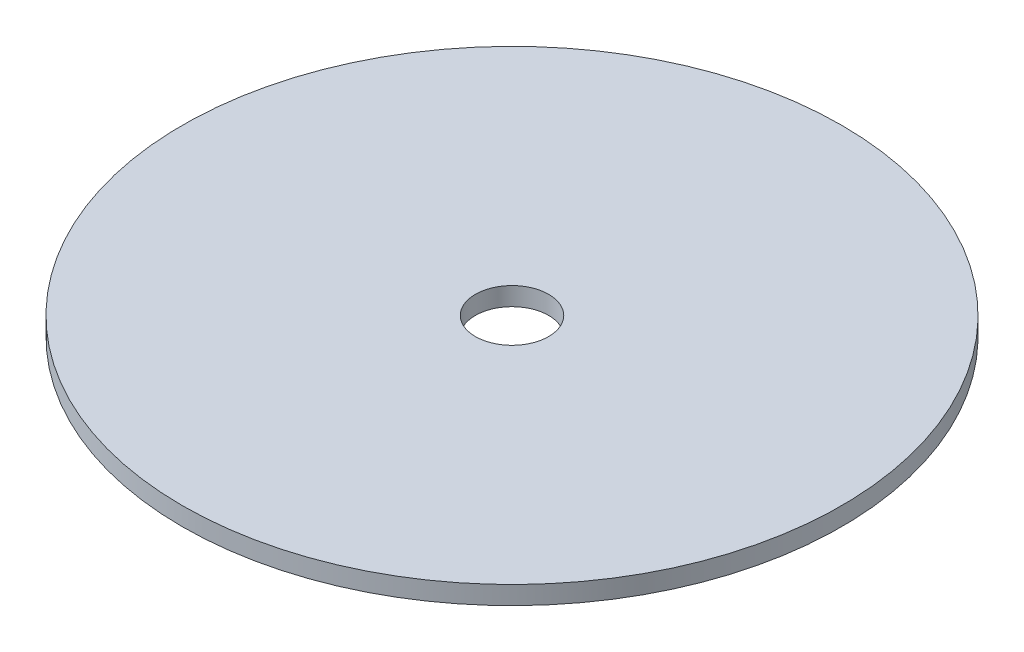
ISO-10303-21;
HEADER;
FILE_DESCRIPTION(('STEP AP214'),'2;1');
FILE_NAME('part.step','',(''),(''),'','','');
FILE_SCHEMA(('AUTOMOTIVE_DESIGN { 1 0 10303 214 1 1 1 1 }'));
ENDSEC;
DATA;
#1=APPLICATION_CONTEXT('core data for automotive mechanical design processes');
#2=APPLICATION_PROTOCOL_DEFINITION('international standard','automotive_design',2000,#1);
#3=PRODUCT_CONTEXT('',#1,'mechanical');
#4=PRODUCT('Part','Part','',(#3));
#5=PRODUCT_RELATED_PRODUCT_CATEGORY('part','',(#4));
#6=PRODUCT_DEFINITION_FORMATION('','',#4);
#7=PRODUCT_DEFINITION_CONTEXT('part definition',#1,'design');
#8=PRODUCT_DEFINITION('design','',#6,#7);
#9=PRODUCT_DEFINITION_SHAPE('','',#8);
#10=(LENGTH_UNIT() NAMED_UNIT(*) SI_UNIT(.MILLI.,.METRE.));
#11=(NAMED_UNIT(*) PLANE_ANGLE_UNIT() SI_UNIT($,.RADIAN.));
#12=(NAMED_UNIT(*) SI_UNIT($,.STERADIAN.) SOLID_ANGLE_UNIT());
#13=UNCERTAINTY_MEASURE_WITH_UNIT(LENGTH_MEASURE(1.E-05),#10,'distance_accuracy_value','');
#14=(GEOMETRIC_REPRESENTATION_CONTEXT(3) GLOBAL_UNCERTAINTY_ASSIGNED_CONTEXT((#13)) GLOBAL_UNIT_ASSIGNED_CONTEXT((#10,
#11,#12)) REPRESENTATION_CONTEXT('',''));
#15=CARTESIAN_POINT('',(0.,0.,0.));
#16=DIRECTION('',(0.,0.,1.));
#17=DIRECTION('',(1.,0.,0.));
#18=AXIS2_PLACEMENT_3D('',#15,#16,#17);
#19=CARTESIAN_POINT('',(0.,2.,0.));
#20=DIRECTION('',(0.,1.,0.));
#21=DIRECTION('',(0.,0.,1.));
#22=AXIS2_PLACEMENT_3D('',#19,#20,#21);
#23=PLANE('',#22);
#24=CARTESIAN_POINT('',(0.,2.,0.));
#25=DIRECTION('',(0.,1.,0.));
#26=DIRECTION('',(0.,0.,1.));
#27=AXIS2_PLACEMENT_3D('',#24,#25,#26);
#28=CIRCLE('',#27,36.);
#29=CARTESIAN_POINT('',(0.,2.,36.));
#30=VERTEX_POINT('',#29);
#31=EDGE_CURVE('E10',#30,#30,#28,.T.);
#32=ORIENTED_EDGE('',*,*,#31,.T.);
#33=EDGE_LOOP('',(#32));
#34=FACE_BOUND('',#33,.T.);
#35=CARTESIAN_POINT('',(0.,2.,0.));
#36=DIRECTION('',(0.,1.,0.));
#37=DIRECTION('',(0.,0.,1.));
#38=AXIS2_PLACEMENT_3D('',#35,#36,#37);
#39=CIRCLE('',#38,4.);
#40=CARTESIAN_POINT('',(0.,2.,4.));
#41=VERTEX_POINT('',#40);
#42=EDGE_CURVE('E54',#41,#41,#39,.T.);
#43=ORIENTED_EDGE('',*,*,#42,.F.);
#44=EDGE_LOOP('',(#43));
#45=FACE_BOUND('',#44,.T.);
#46=ADVANCED_FACE('F41',(#34,#45),#23,.T.);
#47=CARTESIAN_POINT('',(0.,0.,0.));
#48=DIRECTION('',(0.,1.,0.));
#49=DIRECTION('',(0.,0.,1.));
#50=AXIS2_PLACEMENT_3D('',#47,#48,#49);
#51=PLANE('',#50);
#52=CARTESIAN_POINT('',(0.,0.,0.));
#53=DIRECTION('',(0.,1.,0.));
#54=DIRECTION('',(0.,0.,1.));
#55=AXIS2_PLACEMENT_3D('',#52,#53,#54);
#56=CIRCLE('',#55,36.);
#57=CARTESIAN_POINT('',(0.,0.,36.));
#58=VERTEX_POINT('',#57);
#59=EDGE_CURVE('E45',#58,#58,#56,.T.);
#60=ORIENTED_EDGE('',*,*,#59,.F.);
#61=EDGE_LOOP('',(#60));
#62=FACE_BOUND('',#61,.T.);
#63=CARTESIAN_POINT('',(0.,0.,0.));
#64=DIRECTION('',(0.,1.,0.));
#65=DIRECTION('',(0.,0.,1.));
#66=AXIS2_PLACEMENT_3D('',#63,#64,#65);
#67=CIRCLE('',#66,4.);
#68=CARTESIAN_POINT('',(0.,0.,4.));
#69=VERTEX_POINT('',#68);
#70=EDGE_CURVE('E56',#69,#69,#67,.T.);
#71=ORIENTED_EDGE('',*,*,#70,.T.);
#72=EDGE_LOOP('',(#71));
#73=FACE_BOUND('',#72,.T.);
#74=ADVANCED_FACE('F68',(#62,#73),#51,.F.);
#75=CARTESIAN_POINT('',(0.,2.,0.));
#76=DIRECTION('',(0.,-1.,0.));
#77=DIRECTION('',(0.,0.,-1.));
#78=AXIS2_PLACEMENT_3D('',#75,#76,#77);
#79=CYLINDRICAL_SURFACE('',#78,36.);
#80=ORIENTED_EDGE('',*,*,#31,.F.);
#81=EDGE_LOOP('',(#80));
#82=FACE_BOUND('',#81,.T.);
#83=ORIENTED_EDGE('',*,*,#59,.T.);
#84=EDGE_LOOP('',(#83));
#85=FACE_BOUND('',#84,.T.);
#86=ADVANCED_FACE('F43',(#82,#85),#79,.T.);
#87=CARTESIAN_POINT('',(0.,2.,0.));
#88=DIRECTION('',(0.,-1.,0.));
#89=DIRECTION('',(0.,0.,-1.));
#90=AXIS2_PLACEMENT_3D('',#87,#88,#89);
#91=CYLINDRICAL_SURFACE('',#90,4.);
#92=ORIENTED_EDGE('',*,*,#42,.T.);
#93=EDGE_LOOP('',(#92));
#94=FACE_BOUND('',#93,.T.);
#95=ORIENTED_EDGE('',*,*,#70,.F.);
#96=EDGE_LOOP('',(#95));
#97=FACE_BOUND('',#96,.T.);
#98=ADVANCED_FACE('F64',(#94,#97),#91,.F.);
#99=CLOSED_SHELL('',(#46,#74,#86,#98));
#100=MANIFOLD_SOLID_BREP('B2',#99);
#101=ADVANCED_BREP_SHAPE_REPRESENTATION('',(#18,#100),#14);
#102=SHAPE_DEFINITION_REPRESENTATION(#9,#101);
ENDSEC;
END-ISO-10303-21;
